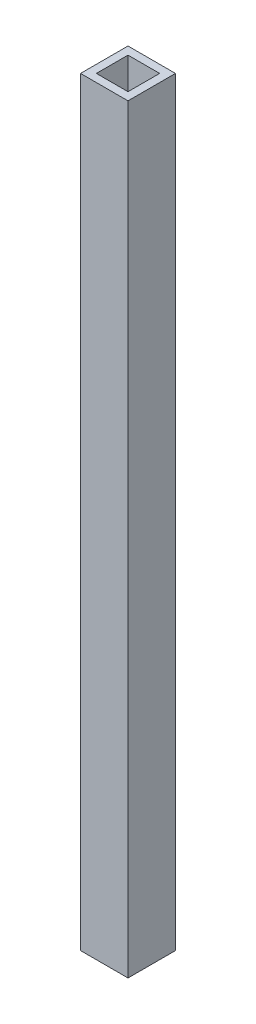
ISO-10303-21;
HEADER;
FILE_DESCRIPTION(('STEP AP214'),'2;1');
FILE_NAME('part.step','',(''),(''),'','','');
FILE_SCHEMA(('AUTOMOTIVE_DESIGN { 1 0 10303 214 1 1 1 1 }'));
ENDSEC;
DATA;
#1=APPLICATION_CONTEXT('core data for automotive mechanical design processes');
#2=APPLICATION_PROTOCOL_DEFINITION('international standard','automotive_design',2000,#1);
#3=PRODUCT_CONTEXT('',#1,'mechanical');
#4=PRODUCT('Part','Part','',(#3));
#5=PRODUCT_RELATED_PRODUCT_CATEGORY('part','',(#4));
#6=PRODUCT_DEFINITION_FORMATION('','',#4);
#7=PRODUCT_DEFINITION_CONTEXT('part definition',#1,'design');
#8=PRODUCT_DEFINITION('design','',#6,#7);
#9=PRODUCT_DEFINITION_SHAPE('','',#8);
#10=(LENGTH_UNIT() NAMED_UNIT(*) SI_UNIT(.MILLI.,.METRE.));
#11=(NAMED_UNIT(*) PLANE_ANGLE_UNIT() SI_UNIT($,.RADIAN.));
#12=(NAMED_UNIT(*) SI_UNIT($,.STERADIAN.) SOLID_ANGLE_UNIT());
#13=UNCERTAINTY_MEASURE_WITH_UNIT(LENGTH_MEASURE(1.E-05),#10,'distance_accuracy_value','');
#14=(GEOMETRIC_REPRESENTATION_CONTEXT(3) GLOBAL_UNCERTAINTY_ASSIGNED_CONTEXT((#13)) GLOBAL_UNIT_ASSIGNED_CONTEXT((#10,
#11,#12)) REPRESENTATION_CONTEXT('',''));
#15=CARTESIAN_POINT('',(0.,0.,0.));
#16=DIRECTION('',(0.,0.,1.));
#17=DIRECTION('',(1.,0.,0.));
#18=AXIS2_PLACEMENT_3D('',#15,#16,#17);
#19=CARTESIAN_POINT('',(0.,304.8,0.));
#20=DIRECTION('',(1.,0.,0.));
#21=DIRECTION('',(0.,0.,-1.));
#22=AXIS2_PLACEMENT_3D('',#19,#20,#21);
#23=PLANE('',#22);
#24=DIRECTION('',(0.,0.,1.));
#25=VECTOR('',#24,1.);
#26=CARTESIAN_POINT('',(0.,0.,0.));
#27=LINE('',#26,#25);
#28=CARTESIAN_POINT('',(0.,0.,-19.05));
#29=VERTEX_POINT('',#28);
#30=CARTESIAN_POINT('',(0.,0.,0.));
#31=VERTEX_POINT('',#30);
#32=EDGE_CURVE('E122',#29,#31,#27,.T.);
#33=ORIENTED_EDGE('',*,*,#32,.T.);
#34=DIRECTION('',(0.,-1.,0.));
#35=VECTOR('',#34,1.);
#36=CARTESIAN_POINT('',(0.,304.8,0.));
#37=LINE('',#36,#35);
#38=CARTESIAN_POINT('',(0.,304.8,0.));
#39=VERTEX_POINT('',#38);
#40=EDGE_CURVE('E151',#39,#31,#37,.T.);
#41=ORIENTED_EDGE('',*,*,#40,.F.);
#42=DIRECTION('',(0.,0.,1.));
#43=VECTOR('',#42,1.);
#44=CARTESIAN_POINT('',(0.,304.8,0.));
#45=LINE('',#44,#43);
#46=CARTESIAN_POINT('',(0.,304.8,-19.05));
#47=VERTEX_POINT('',#46);
#48=EDGE_CURVE('E125',#47,#39,#45,.T.);
#49=ORIENTED_EDGE('',*,*,#48,.F.);
#50=DIRECTION('',(0.,-1.,0.));
#51=VECTOR('',#50,1.);
#52=CARTESIAN_POINT('',(0.,304.8,-19.05));
#53=LINE('',#52,#51);
#54=EDGE_CURVE('E135',#47,#29,#53,.T.);
#55=ORIENTED_EDGE('',*,*,#54,.T.);
#56=EDGE_LOOP('',(#33,#41,#49,#55));
#57=FACE_BOUND('',#56,.T.);
#58=ADVANCED_FACE('F33',(#57),#23,.F.);
#59=CARTESIAN_POINT('',(0.,304.8,0.));
#60=DIRECTION('',(0.,0.,-1.));
#61=DIRECTION('',(-1.,0.,0.));
#62=AXIS2_PLACEMENT_3D('',#59,#60,#61);
#63=PLANE('',#62);
#64=DIRECTION('',(1.,0.,0.));
#65=VECTOR('',#64,1.);
#66=CARTESIAN_POINT('',(0.,0.,0.));
#67=LINE('',#66,#65);
#68=CARTESIAN_POINT('',(19.05,0.,0.));
#69=VERTEX_POINT('',#68);
#70=EDGE_CURVE('E138',#31,#69,#67,.T.);
#71=ORIENTED_EDGE('',*,*,#70,.T.);
#72=DIRECTION('',(0.,-1.,0.));
#73=VECTOR('',#72,1.);
#74=CARTESIAN_POINT('',(19.05,304.8,0.));
#75=LINE('',#74,#73);
#76=CARTESIAN_POINT('',(19.05,304.8,0.));
#77=VERTEX_POINT('',#76);
#78=EDGE_CURVE('E148',#77,#69,#75,.T.);
#79=ORIENTED_EDGE('',*,*,#78,.F.);
#80=DIRECTION('',(1.,0.,0.));
#81=VECTOR('',#80,1.);
#82=CARTESIAN_POINT('',(0.,304.8,0.));
#83=LINE('',#82,#81);
#84=EDGE_CURVE('E128',#39,#77,#83,.T.);
#85=ORIENTED_EDGE('',*,*,#84,.F.);
#86=ORIENTED_EDGE('',*,*,#40,.T.);
#87=EDGE_LOOP('',(#71,#79,#85,#86));
#88=FACE_BOUND('',#87,.T.);
#89=ADVANCED_FACE('F176',(#88),#63,.F.);
#90=CARTESIAN_POINT('',(19.05,304.8,0.));
#91=DIRECTION('',(-1.,0.,0.));
#92=DIRECTION('',(0.,0.,1.));
#93=AXIS2_PLACEMENT_3D('',#90,#91,#92);
#94=PLANE('',#93);
#95=DIRECTION('',(0.,0.,-1.));
#96=VECTOR('',#95,1.);
#97=CARTESIAN_POINT('',(19.05,0.,0.));
#98=LINE('',#97,#96);
#99=CARTESIAN_POINT('',(19.05,0.,-19.05));
#100=VERTEX_POINT('',#99);
#101=EDGE_CURVE('E140',#69,#100,#98,.T.);
#102=ORIENTED_EDGE('',*,*,#101,.T.);
#103=DIRECTION('',(0.,-1.,0.));
#104=VECTOR('',#103,1.);
#105=CARTESIAN_POINT('',(19.05,304.8,-19.05));
#106=LINE('',#105,#104);
#107=CARTESIAN_POINT('',(19.05,304.8,-19.05));
#108=VERTEX_POINT('',#107);
#109=EDGE_CURVE('E145',#108,#100,#106,.T.);
#110=ORIENTED_EDGE('',*,*,#109,.F.);
#111=DIRECTION('',(0.,0.,-1.));
#112=VECTOR('',#111,1.);
#113=CARTESIAN_POINT('',(19.05,304.8,0.));
#114=LINE('',#113,#112);
#115=EDGE_CURVE('E131',#77,#108,#114,.T.);
#116=ORIENTED_EDGE('',*,*,#115,.F.);
#117=ORIENTED_EDGE('',*,*,#78,.T.);
#118=EDGE_LOOP('',(#102,#110,#116,#117));
#119=FACE_BOUND('',#118,.T.);
#120=ADVANCED_FACE('F181',(#119),#94,.F.);
#121=CARTESIAN_POINT('',(0.,304.8,-19.05));
#122=DIRECTION('',(0.,0.,1.));
#123=DIRECTION('',(1.,0.,0.));
#124=AXIS2_PLACEMENT_3D('',#121,#122,#123);
#125=PLANE('',#124);
#126=DIRECTION('',(-1.,0.,0.));
#127=VECTOR('',#126,1.);
#128=CARTESIAN_POINT('',(0.,0.,-19.05));
#129=LINE('',#128,#127);
#130=EDGE_CURVE('E129',#100,#29,#129,.T.);
#131=ORIENTED_EDGE('',*,*,#130,.T.);
#132=ORIENTED_EDGE('',*,*,#54,.F.);
#133=DIRECTION('',(-1.,0.,0.));
#134=VECTOR('',#133,1.);
#135=CARTESIAN_POINT('',(0.,304.8,-19.05));
#136=LINE('',#135,#134);
#137=EDGE_CURVE('E133',#108,#47,#136,.T.);
#138=ORIENTED_EDGE('',*,*,#137,.F.);
#139=ORIENTED_EDGE('',*,*,#109,.T.);
#140=EDGE_LOOP('',(#131,#132,#138,#139));
#141=FACE_BOUND('',#140,.T.);
#142=ADVANCED_FACE('F194',(#141),#125,.F.);
#143=CARTESIAN_POINT('',(0.,304.8,0.));
#144=DIRECTION('',(0.,-1.,0.));
#145=DIRECTION('',(0.,0.,-1.));
#146=AXIS2_PLACEMENT_3D('',#143,#144,#145);
#147=PLANE('',#146);
#148=DIRECTION('',(1.,0.,0.));
#149=VECTOR('',#148,1.);
#150=CARTESIAN_POINT('',(3.175,304.8,-3.175));
#151=LINE('',#150,#149);
#152=CARTESIAN_POINT('',(3.175,304.8,-3.175));
#153=VERTEX_POINT('',#152);
#154=CARTESIAN_POINT('',(15.875,304.8,-3.175));
#155=VERTEX_POINT('',#154);
#156=EDGE_CURVE('E108',#153,#155,#151,.T.);
#157=ORIENTED_EDGE('',*,*,#156,.F.);
#158=DIRECTION('',(0.,0.,1.));
#159=VECTOR('',#158,1.);
#160=CARTESIAN_POINT('',(3.175,304.8,-15.875));
#161=LINE('',#160,#159);
#162=CARTESIAN_POINT('',(3.175,304.8,-15.875));
#163=VERTEX_POINT('',#162);
#164=EDGE_CURVE('E47',#163,#153,#161,.T.);
#165=ORIENTED_EDGE('',*,*,#164,.F.);
#166=DIRECTION('',(-1.,0.,0.));
#167=VECTOR('',#166,1.);
#168=CARTESIAN_POINT('',(3.175,304.8,-15.875));
#169=LINE('',#168,#167);
#170=CARTESIAN_POINT('',(15.875,304.8,-15.875));
#171=VERTEX_POINT('',#170);
#172=EDGE_CURVE('E115',#171,#163,#169,.T.);
#173=ORIENTED_EDGE('',*,*,#172,.F.);
#174=DIRECTION('',(0.,0.,-1.));
#175=VECTOR('',#174,1.);
#176=CARTESIAN_POINT('',(15.875,304.8,-15.875));
#177=LINE('',#176,#175);
#178=EDGE_CURVE('E99',#155,#171,#177,.T.);
#179=ORIENTED_EDGE('',*,*,#178,.F.);
#180=EDGE_LOOP('',(#157,#165,#173,#179));
#181=FACE_BOUND('',#180,.T.);
#182=ORIENTED_EDGE('',*,*,#48,.T.);
#183=ORIENTED_EDGE('',*,*,#84,.T.);
#184=ORIENTED_EDGE('',*,*,#115,.T.);
#185=ORIENTED_EDGE('',*,*,#137,.T.);
#186=EDGE_LOOP('',(#182,#183,#184,#185));
#187=FACE_BOUND('',#186,.T.);
#188=ADVANCED_FACE('F112',(#181,#187),#147,.F.);
#189=CARTESIAN_POINT('',(0.,0.,0.));
#190=DIRECTION('',(0.,-1.,0.));
#191=DIRECTION('',(0.,0.,-1.));
#192=AXIS2_PLACEMENT_3D('',#189,#190,#191);
#193=PLANE('',#192);
#194=DIRECTION('',(0.,0.,-1.));
#195=VECTOR('',#194,1.);
#196=CARTESIAN_POINT('',(3.175,0.,0.));
#197=LINE('',#196,#195);
#198=CARTESIAN_POINT('',(3.175,0.,-3.175));
#199=VERTEX_POINT('',#198);
#200=CARTESIAN_POINT('',(3.175,0.,-15.875));
#201=VERTEX_POINT('',#200);
#202=EDGE_CURVE('E11',#199,#201,#197,.T.);
#203=ORIENTED_EDGE('',*,*,#202,.F.);
#204=DIRECTION('',(-1.,0.,0.));
#205=VECTOR('',#204,1.);
#206=CARTESIAN_POINT('',(0.,0.,-3.175));
#207=LINE('',#206,#205);
#208=CARTESIAN_POINT('',(15.875,0.,-3.175));
#209=VERTEX_POINT('',#208);
#210=EDGE_CURVE('E154',#209,#199,#207,.T.);
#211=ORIENTED_EDGE('',*,*,#210,.F.);
#212=DIRECTION('',(0.,0.,1.));
#213=VECTOR('',#212,1.);
#214=CARTESIAN_POINT('',(15.875,0.,0.));
#215=LINE('',#214,#213);
#216=CARTESIAN_POINT('',(15.875,0.,-15.875));
#217=VERTEX_POINT('',#216);
#218=EDGE_CURVE('E102',#217,#209,#215,.T.);
#219=ORIENTED_EDGE('',*,*,#218,.F.);
#220=DIRECTION('',(1.,0.,0.));
#221=VECTOR('',#220,1.);
#222=CARTESIAN_POINT('',(0.,0.,-15.875));
#223=LINE('',#222,#221);
#224=EDGE_CURVE('E40',#201,#217,#223,.T.);
#225=ORIENTED_EDGE('',*,*,#224,.F.);
#226=EDGE_LOOP('',(#203,#211,#219,#225));
#227=FACE_BOUND('',#226,.T.);
#228=ORIENTED_EDGE('',*,*,#32,.F.);
#229=ORIENTED_EDGE('',*,*,#130,.F.);
#230=ORIENTED_EDGE('',*,*,#101,.F.);
#231=ORIENTED_EDGE('',*,*,#70,.F.);
#232=EDGE_LOOP('',(#228,#229,#230,#231));
#233=FACE_BOUND('',#232,.T.);
#234=ADVANCED_FACE('F162',(#227,#233),#193,.T.);
#235=CARTESIAN_POINT('',(3.175,-101.6,-15.875));
#236=DIRECTION('',(-1.,0.,0.));
#237=DIRECTION('',(0.,0.,1.));
#238=AXIS2_PLACEMENT_3D('',#235,#236,#237);
#239=PLANE('',#238);
#240=ORIENTED_EDGE('',*,*,#202,.T.);
#241=DIRECTION('',(0.,1.,0.));
#242=VECTOR('',#241,1.);
#243=CARTESIAN_POINT('',(3.175,-101.6,-15.875));
#244=LINE('',#243,#242);
#245=EDGE_CURVE('E120',#201,#163,#244,.T.);
#246=ORIENTED_EDGE('',*,*,#245,.T.);
#247=ORIENTED_EDGE('',*,*,#164,.T.);
#248=DIRECTION('',(0.,1.,0.));
#249=VECTOR('',#248,1.);
#250=CARTESIAN_POINT('',(3.175,-101.6,-3.175));
#251=LINE('',#250,#249);
#252=EDGE_CURVE('E105',#199,#153,#251,.T.);
#253=ORIENTED_EDGE('',*,*,#252,.F.);
#254=EDGE_LOOP('',(#240,#246,#247,#253));
#255=FACE_BOUND('',#254,.T.);
#256=ADVANCED_FACE('F164',(#255),#239,.F.);
#257=CARTESIAN_POINT('',(3.175,-101.6,-15.875));
#258=DIRECTION('',(0.,0.,-1.));
#259=DIRECTION('',(-1.,0.,0.));
#260=AXIS2_PLACEMENT_3D('',#257,#258,#259);
#261=PLANE('',#260);
#262=ORIENTED_EDGE('',*,*,#224,.T.);
#263=DIRECTION('',(0.,1.,0.));
#264=VECTOR('',#263,1.);
#265=CARTESIAN_POINT('',(15.875,-101.6,-15.875));
#266=LINE('',#265,#264);
#267=EDGE_CURVE('E104',#217,#171,#266,.T.);
#268=ORIENTED_EDGE('',*,*,#267,.T.);
#269=ORIENTED_EDGE('',*,*,#172,.T.);
#270=ORIENTED_EDGE('',*,*,#245,.F.);
#271=EDGE_LOOP('',(#262,#268,#269,#270));
#272=FACE_BOUND('',#271,.T.);
#273=ADVANCED_FACE('F159',(#272),#261,.F.);
#274=CARTESIAN_POINT('',(15.875,-101.6,-15.875));
#275=DIRECTION('',(1.,0.,0.));
#276=DIRECTION('',(0.,0.,-1.));
#277=AXIS2_PLACEMENT_3D('',#274,#275,#276);
#278=PLANE('',#277);
#279=ORIENTED_EDGE('',*,*,#218,.T.);
#280=DIRECTION('',(0.,1.,0.));
#281=VECTOR('',#280,1.);
#282=CARTESIAN_POINT('',(15.875,-101.6,-3.175));
#283=LINE('',#282,#281);
#284=EDGE_CURVE('E55',#209,#155,#283,.T.);
#285=ORIENTED_EDGE('',*,*,#284,.T.);
#286=ORIENTED_EDGE('',*,*,#178,.T.);
#287=ORIENTED_EDGE('',*,*,#267,.F.);
#288=EDGE_LOOP('',(#279,#285,#286,#287));
#289=FACE_BOUND('',#288,.T.);
#290=ADVANCED_FACE('F96',(#289),#278,.F.);
#291=CARTESIAN_POINT('',(3.175,-101.6,-3.175));
#292=DIRECTION('',(0.,0.,1.));
#293=DIRECTION('',(1.,0.,0.));
#294=AXIS2_PLACEMENT_3D('',#291,#292,#293);
#295=PLANE('',#294);
#296=ORIENTED_EDGE('',*,*,#210,.T.);
#297=ORIENTED_EDGE('',*,*,#252,.T.);
#298=ORIENTED_EDGE('',*,*,#156,.T.);
#299=ORIENTED_EDGE('',*,*,#284,.F.);
#300=EDGE_LOOP('',(#296,#297,#298,#299));
#301=FACE_BOUND('',#300,.T.);
#302=ADVANCED_FACE('F109',(#301),#295,.F.);
#303=CLOSED_SHELL('',(#58,#89,#120,#142,#188,#234,#256,#273,#290,#302));
#304=MANIFOLD_SOLID_BREP('B2',#303);
#305=ADVANCED_BREP_SHAPE_REPRESENTATION('',(#18,#304),#14);
#306=SHAPE_DEFINITION_REPRESENTATION(#9,#305);
ENDSEC;
END-ISO-10303-21;
